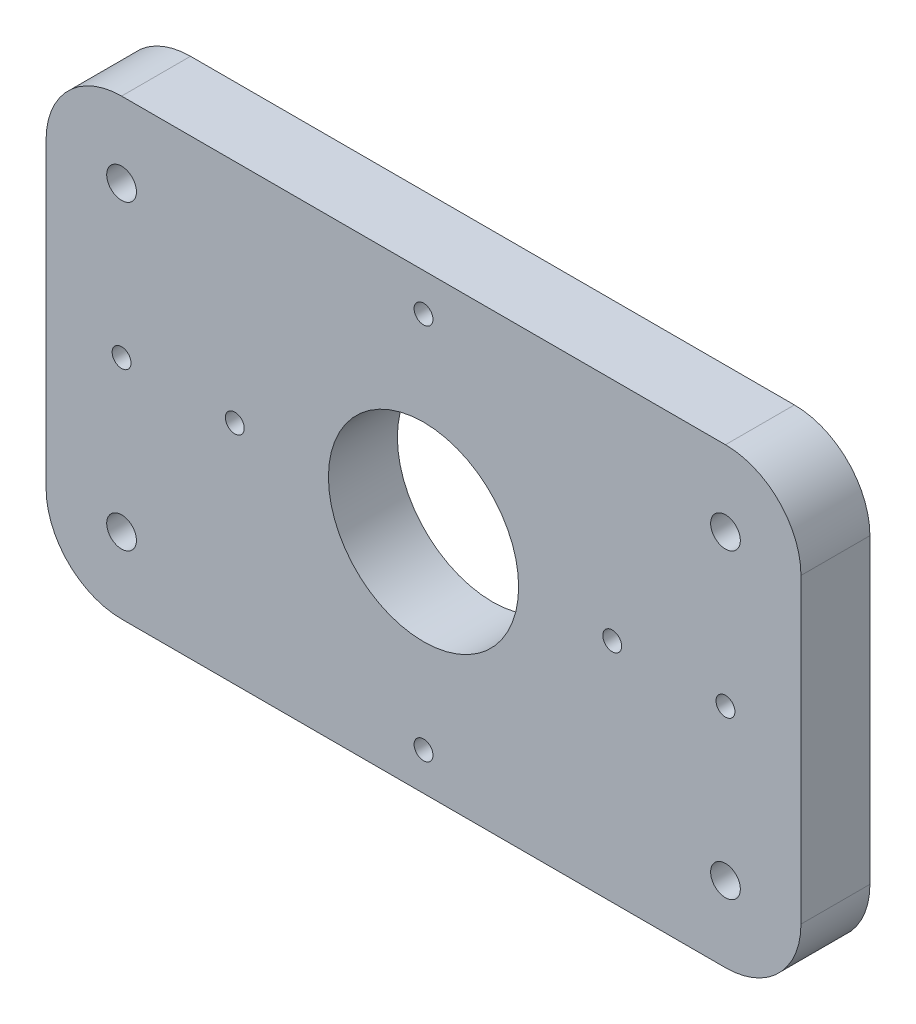
ISO-10303-21;
HEADER;
FILE_DESCRIPTION(('STEP AP214'),'2;1');
FILE_NAME('part.step','',(''),(''),'','','');
FILE_SCHEMA(('AUTOMOTIVE_DESIGN { 1 0 10303 214 1 1 1 1 }'));
ENDSEC;
DATA;
#1=APPLICATION_CONTEXT('core data for automotive mechanical design processes');
#2=APPLICATION_PROTOCOL_DEFINITION('international standard','automotive_design',2000,#1);
#3=PRODUCT_CONTEXT('',#1,'mechanical');
#4=PRODUCT('Part','Part','',(#3));
#5=PRODUCT_RELATED_PRODUCT_CATEGORY('part','',(#4));
#6=PRODUCT_DEFINITION_FORMATION('','',#4);
#7=PRODUCT_DEFINITION_CONTEXT('part definition',#1,'design');
#8=PRODUCT_DEFINITION('design','',#6,#7);
#9=PRODUCT_DEFINITION_SHAPE('','',#8);
#10=(LENGTH_UNIT() NAMED_UNIT(*) SI_UNIT(.MILLI.,.METRE.));
#11=(NAMED_UNIT(*) PLANE_ANGLE_UNIT() SI_UNIT($,.RADIAN.));
#12=(NAMED_UNIT(*) SI_UNIT($,.STERADIAN.) SOLID_ANGLE_UNIT());
#13=UNCERTAINTY_MEASURE_WITH_UNIT(LENGTH_MEASURE(1.E-05),#10,'distance_accuracy_value','');
#14=(GEOMETRIC_REPRESENTATION_CONTEXT(3) GLOBAL_UNCERTAINTY_ASSIGNED_CONTEXT((#13)) GLOBAL_UNIT_ASSIGNED_CONTEXT((#10,
#11,#12)) REPRESENTATION_CONTEXT('',''));
#15=CARTESIAN_POINT('',(0.,0.,0.));
#16=DIRECTION('',(0.,0.,1.));
#17=DIRECTION('',(1.,0.,0.));
#18=AXIS2_PLACEMENT_3D('',#15,#16,#17);
#19=CARTESIAN_POINT('',(0.,38.1,5.8));
#20=DIRECTION('',(0.,-1.,0.));
#21=DIRECTION('',(1.,0.,0.));
#22=AXIS2_PLACEMENT_3D('',#19,#20,#21);
#23=PLANE('',#22);
#24=DIRECTION('',(-1.,0.,0.));
#25=VECTOR('',#24,1.);
#26=CARTESIAN_POINT('',(0.,38.1,5.8));
#27=LINE('',#26,#25);
#28=CARTESIAN_POINT('',(6.35,38.1,5.8));
#29=VERTEX_POINT('',#28);
#30=CARTESIAN_POINT('',(-44.45,38.1,5.8));
#31=VERTEX_POINT('',#30);
#32=EDGE_CURVE('E115',#29,#31,#27,.T.);
#33=ORIENTED_EDGE('',*,*,#32,.F.);
#34=DIRECTION('',(0.,0.,1.));
#35=VECTOR('',#34,1.);
#36=CARTESIAN_POINT('',(6.35,38.1,0.));
#37=LINE('',#36,#35);
#38=CARTESIAN_POINT('',(6.35,38.1,0.));
#39=VERTEX_POINT('',#38);
#40=EDGE_CURVE('E132',#29,#39,#37,.F.);
#41=ORIENTED_EDGE('',*,*,#40,.T.);
#42=DIRECTION('',(-1.,0.,0.));
#43=VECTOR('',#42,1.);
#44=CARTESIAN_POINT('',(0.,38.1,0.));
#45=LINE('',#44,#43);
#46=CARTESIAN_POINT('',(-44.45,38.1,0.));
#47=VERTEX_POINT('',#46);
#48=EDGE_CURVE('E116',#39,#47,#45,.T.);
#49=ORIENTED_EDGE('',*,*,#48,.T.);
#50=DIRECTION('',(0.,0.,1.));
#51=VECTOR('',#50,1.);
#52=CARTESIAN_POINT('',(-44.45,38.1,5.8));
#53=LINE('',#52,#51);
#54=EDGE_CURVE('E129',#47,#31,#53,.T.);
#55=ORIENTED_EDGE('',*,*,#54,.T.);
#56=EDGE_LOOP('',(#33,#41,#49,#55));
#57=FACE_BOUND('',#56,.T.);
#58=ADVANCED_FACE('F34',(#57),#23,.F.);
#59=CARTESIAN_POINT('',(0.,0.,5.8));
#60=DIRECTION('',(0.,1.,0.));
#61=DIRECTION('',(-1.,0.,0.));
#62=AXIS2_PLACEMENT_3D('',#59,#60,#61);
#63=PLANE('',#62);
#64=DIRECTION('',(1.,0.,0.));
#65=VECTOR('',#64,1.);
#66=CARTESIAN_POINT('',(0.,0.,0.));
#67=LINE('',#66,#65);
#68=CARTESIAN_POINT('',(-44.45,0.,0.));
#69=VERTEX_POINT('',#68);
#70=CARTESIAN_POINT('',(6.35,0.,0.));
#71=VERTEX_POINT('',#70);
#72=EDGE_CURVE('E104',#69,#71,#67,.T.);
#73=ORIENTED_EDGE('',*,*,#72,.T.);
#74=DIRECTION('',(0.,0.,1.));
#75=VECTOR('',#74,1.);
#76=CARTESIAN_POINT('',(6.35,0.,5.8));
#77=LINE('',#76,#75);
#78=CARTESIAN_POINT('',(6.35,0.,5.8));
#79=VERTEX_POINT('',#78);
#80=EDGE_CURVE('E109',#71,#79,#77,.T.);
#81=ORIENTED_EDGE('',*,*,#80,.T.);
#82=DIRECTION('',(1.,0.,0.));
#83=VECTOR('',#82,1.);
#84=CARTESIAN_POINT('',(0.,0.,5.8));
#85=LINE('',#84,#83);
#86=CARTESIAN_POINT('',(-44.45,0.,5.8));
#87=VERTEX_POINT('',#86);
#88=EDGE_CURVE('E107',#87,#79,#85,.T.);
#89=ORIENTED_EDGE('',*,*,#88,.F.);
#90=DIRECTION('',(0.,0.,1.));
#91=VECTOR('',#90,1.);
#92=CARTESIAN_POINT('',(-44.45,0.,0.));
#93=LINE('',#92,#91);
#94=EDGE_CURVE('E101',#87,#69,#93,.F.);
#95=ORIENTED_EDGE('',*,*,#94,.T.);
#96=EDGE_LOOP('',(#73,#81,#89,#95));
#97=FACE_BOUND('',#96,.T.);
#98=ADVANCED_FACE('F102',(#97),#63,.F.);
#99=CARTESIAN_POINT('',(0.,38.1,5.8));
#100=DIRECTION('',(0.,0.,1.));
#101=DIRECTION('',(1.,0.,0.));
#102=AXIS2_PLACEMENT_3D('',#99,#100,#101);
#103=PLANE('',#102);
#104=CARTESIAN_POINT('',(6.35000000000002,19.05,5.8));
#105=DIRECTION('',(0.,0.,1.));
#106=DIRECTION('',(1.,0.,0.));
#107=AXIS2_PLACEMENT_3D('',#104,#105,#106);
#108=CIRCLE('',#107,0.79375);
#109=CARTESIAN_POINT('',(7.14375000000002,19.05,5.8));
#110=VERTEX_POINT('',#109);
#111=EDGE_CURVE('E235',#110,#110,#108,.T.);
#112=ORIENTED_EDGE('',*,*,#111,.F.);
#113=EDGE_LOOP('',(#112));
#114=FACE_BOUND('',#113,.T.);
#115=CARTESIAN_POINT('',(-44.45,19.05,5.8));
#116=DIRECTION('',(0.,0.,1.));
#117=DIRECTION('',(1.,0.,0.));
#118=AXIS2_PLACEMENT_3D('',#115,#116,#117);
#119=CIRCLE('',#118,0.793749999999999);
#120=CARTESIAN_POINT('',(-43.65625,19.05,5.8));
#121=VERTEX_POINT('',#120);
#122=EDGE_CURVE('E229',#121,#121,#119,.T.);
#123=ORIENTED_EDGE('',*,*,#122,.F.);
#124=EDGE_LOOP('',(#123));
#125=FACE_BOUND('',#124,.T.);
#126=CARTESIAN_POINT('',(-44.45,31.75,5.8));
#127=DIRECTION('',(0.,0.,1.));
#128=DIRECTION('',(1.,0.,0.));
#129=AXIS2_PLACEMENT_3D('',#126,#127,#128);
#130=CIRCLE('',#129,1.24999999999999);
#131=CARTESIAN_POINT('',(-43.2,31.75,5.8));
#132=VERTEX_POINT('',#131);
#133=EDGE_CURVE('E168',#132,#132,#130,.T.);
#134=ORIENTED_EDGE('',*,*,#133,.F.);
#135=EDGE_LOOP('',(#134));
#136=FACE_BOUND('',#135,.T.);
#137=CARTESIAN_POINT('',(6.35000000000002,31.75,5.8));
#138=DIRECTION('',(0.,0.,1.));
#139=DIRECTION('',(1.,0.,0.));
#140=AXIS2_PLACEMENT_3D('',#137,#138,#139);
#141=CIRCLE('',#140,1.24999999999999);
#142=CARTESIAN_POINT('',(7.6,31.75,5.8));
#143=VERTEX_POINT('',#142);
#144=EDGE_CURVE('E167',#143,#143,#141,.T.);
#145=ORIENTED_EDGE('',*,*,#144,.F.);
#146=EDGE_LOOP('',(#145));
#147=FACE_BOUND('',#146,.T.);
#148=CARTESIAN_POINT('',(6.35000000000002,6.35,5.8));
#149=DIRECTION('',(0.,0.,1.));
#150=DIRECTION('',(1.,0.,0.));
#151=AXIS2_PLACEMENT_3D('',#148,#149,#150);
#152=CIRCLE('',#151,1.24999999999999);
#153=CARTESIAN_POINT('',(7.6,6.35,5.8));
#154=VERTEX_POINT('',#153);
#155=EDGE_CURVE('E172',#154,#154,#152,.T.);
#156=ORIENTED_EDGE('',*,*,#155,.F.);
#157=EDGE_LOOP('',(#156));
#158=FACE_BOUND('',#157,.T.);
#159=CARTESIAN_POINT('',(-44.45,6.35000000000003,5.8));
#160=DIRECTION('',(0.,0.,1.));
#161=DIRECTION('',(1.,0.,0.));
#162=AXIS2_PLACEMENT_3D('',#159,#160,#161);
#163=CIRCLE('',#162,1.24999999999999);
#164=CARTESIAN_POINT('',(-43.2,6.35000000000003,5.8));
#165=VERTEX_POINT('',#164);
#166=EDGE_CURVE('E176',#165,#165,#163,.T.);
#167=ORIENTED_EDGE('',*,*,#166,.F.);
#168=EDGE_LOOP('',(#167));
#169=FACE_BOUND('',#168,.T.);
#170=CARTESIAN_POINT('',(-19.0500000000001,3.175,5.8));
#171=DIRECTION('',(0.,0.,1.));
#172=DIRECTION('',(1.,0.,0.));
#173=AXIS2_PLACEMENT_3D('',#170,#171,#172);
#174=CIRCLE('',#173,0.793749999999999);
#175=CARTESIAN_POINT('',(-18.2562500000001,3.175,5.8));
#176=VERTEX_POINT('',#175);
#177=EDGE_CURVE('E207',#176,#176,#174,.T.);
#178=ORIENTED_EDGE('',*,*,#177,.F.);
#179=EDGE_LOOP('',(#178));
#180=FACE_BOUND('',#179,.T.);
#181=CARTESIAN_POINT('',(-3.175,19.0499999999999,5.8));
#182=DIRECTION('',(0.,0.,1.));
#183=DIRECTION('',(1.,0.,0.));
#184=AXIS2_PLACEMENT_3D('',#181,#182,#183);
#185=CIRCLE('',#184,0.79375);
#186=CARTESIAN_POINT('',(-2.38125,19.0499999999999,5.8));
#187=VERTEX_POINT('',#186);
#188=EDGE_CURVE('E201',#187,#187,#185,.T.);
#189=ORIENTED_EDGE('',*,*,#188,.F.);
#190=EDGE_LOOP('',(#189));
#191=FACE_BOUND('',#190,.T.);
#192=CARTESIAN_POINT('',(-19.05,34.925,5.8));
#193=DIRECTION('',(0.,0.,1.));
#194=DIRECTION('',(1.,0.,0.));
#195=AXIS2_PLACEMENT_3D('',#192,#193,#194);
#196=CIRCLE('',#195,0.793749999999999);
#197=CARTESIAN_POINT('',(-18.25625,34.925,5.8));
#198=VERTEX_POINT('',#197);
#199=EDGE_CURVE('E195',#198,#198,#196,.T.);
#200=ORIENTED_EDGE('',*,*,#199,.F.);
#201=EDGE_LOOP('',(#200));
#202=FACE_BOUND('',#201,.T.);
#203=CARTESIAN_POINT('',(-34.925,19.05,5.8));
#204=DIRECTION('',(0.,0.,1.));
#205=DIRECTION('',(1.,0.,0.));
#206=AXIS2_PLACEMENT_3D('',#203,#204,#205);
#207=CIRCLE('',#206,0.793749999999999);
#208=CARTESIAN_POINT('',(-34.13125,19.05,5.8));
#209=VERTEX_POINT('',#208);
#210=EDGE_CURVE('E189',#209,#209,#207,.T.);
#211=ORIENTED_EDGE('',*,*,#210,.F.);
#212=EDGE_LOOP('',(#211));
#213=FACE_BOUND('',#212,.T.);
#214=CARTESIAN_POINT('',(-19.05,19.05,5.8));
#215=DIRECTION('',(0.,0.,1.));
#216=DIRECTION('',(1.,0.,0.));
#217=AXIS2_PLACEMENT_3D('',#214,#215,#216);
#218=CIRCLE('',#217,8.);
#219=CARTESIAN_POINT('',(-11.05,19.05,5.8));
#220=VERTEX_POINT('',#219);
#221=EDGE_CURVE('E182',#220,#220,#218,.T.);
#222=ORIENTED_EDGE('',*,*,#221,.F.);
#223=EDGE_LOOP('',(#222));
#224=FACE_BOUND('',#223,.T.);
#225=ORIENTED_EDGE('',*,*,#88,.T.);
#226=CARTESIAN_POINT('',(6.35,6.35,5.8));
#227=DIRECTION('',(0.,0.,1.));
#228=DIRECTION('',(1.,0.,0.));
#229=AXIS2_PLACEMENT_3D('',#226,#227,#228);
#230=CIRCLE('',#229,6.35);
#231=CARTESIAN_POINT('',(12.7,6.35,5.8));
#232=VERTEX_POINT('',#231);
#233=EDGE_CURVE('E154',#79,#232,#230,.T.);
#234=ORIENTED_EDGE('',*,*,#233,.T.);
#235=DIRECTION('',(0.,1.,0.));
#236=VECTOR('',#235,1.);
#237=CARTESIAN_POINT('',(12.7,0.,5.8));
#238=LINE('',#237,#236);
#239=CARTESIAN_POINT('',(12.7,31.75,5.8));
#240=VERTEX_POINT('',#239);
#241=EDGE_CURVE('E213',#232,#240,#238,.T.);
#242=ORIENTED_EDGE('',*,*,#241,.T.);
#243=CARTESIAN_POINT('',(6.35,31.75,5.8));
#244=DIRECTION('',(0.,0.,1.));
#245=DIRECTION('',(1.,0.,0.));
#246=AXIS2_PLACEMENT_3D('',#243,#244,#245);
#247=CIRCLE('',#246,6.35);
#248=EDGE_CURVE('E150',#240,#29,#247,.T.);
#249=ORIENTED_EDGE('',*,*,#248,.T.);
#250=ORIENTED_EDGE('',*,*,#32,.T.);
#251=CARTESIAN_POINT('',(-44.45,31.75,5.8));
#252=DIRECTION('',(0.,0.,1.));
#253=DIRECTION('',(1.,0.,0.));
#254=AXIS2_PLACEMENT_3D('',#251,#252,#253);
#255=CIRCLE('',#254,6.35);
#256=CARTESIAN_POINT('',(-50.8,31.75,5.8));
#257=VERTEX_POINT('',#256);
#258=EDGE_CURVE('E161',#31,#257,#255,.T.);
#259=ORIENTED_EDGE('',*,*,#258,.T.);
#260=DIRECTION('',(0.,-1.,0.));
#261=VECTOR('',#260,1.);
#262=CARTESIAN_POINT('',(-50.8,0.,5.8));
#263=LINE('',#262,#261);
#264=CARTESIAN_POINT('',(-50.8,6.34999999999999,5.8));
#265=VERTEX_POINT('',#264);
#266=EDGE_CURVE('E180',#257,#265,#263,.T.);
#267=ORIENTED_EDGE('',*,*,#266,.T.);
#268=CARTESIAN_POINT('',(-44.45,6.34999999999999,5.8));
#269=DIRECTION('',(0.,0.,1.));
#270=DIRECTION('',(1.,0.,0.));
#271=AXIS2_PLACEMENT_3D('',#268,#269,#270);
#272=CIRCLE('',#271,6.35);
#273=EDGE_CURVE('E159',#265,#87,#272,.T.);
#274=ORIENTED_EDGE('',*,*,#273,.T.);
#275=EDGE_LOOP('',(#225,#234,#242,#249,#250,#259,#267,#274));
#276=FACE_BOUND('',#275,.T.);
#277=ADVANCED_FACE('F251',(#114,#125,#136,#147,#158,#169,#180,#191,#202,#213,#224,#276),#103,.T.);
#278=CARTESIAN_POINT('',(0.,38.1,0.));
#279=DIRECTION('',(0.,0.,1.));
#280=DIRECTION('',(1.,0.,0.));
#281=AXIS2_PLACEMENT_3D('',#278,#279,#280);
#282=PLANE('',#281);
#283=CARTESIAN_POINT('',(6.35000000000002,19.05,0.));
#284=DIRECTION('',(0.,0.,1.));
#285=DIRECTION('',(1.,0.,0.));
#286=AXIS2_PLACEMENT_3D('',#283,#284,#285);
#287=CIRCLE('',#286,0.79375);
#288=CARTESIAN_POINT('',(7.14375000000002,19.05,0.));
#289=VERTEX_POINT('',#288);
#290=EDGE_CURVE('E232',#289,#289,#287,.T.);
#291=ORIENTED_EDGE('',*,*,#290,.T.);
#292=EDGE_LOOP('',(#291));
#293=FACE_BOUND('',#292,.T.);
#294=CARTESIAN_POINT('',(-44.45,19.05,0.));
#295=DIRECTION('',(0.,0.,1.));
#296=DIRECTION('',(1.,0.,0.));
#297=AXIS2_PLACEMENT_3D('',#294,#295,#296);
#298=CIRCLE('',#297,0.793749999999999);
#299=CARTESIAN_POINT('',(-43.65625,19.05,0.));
#300=VERTEX_POINT('',#299);
#301=EDGE_CURVE('E228',#300,#300,#298,.T.);
#302=ORIENTED_EDGE('',*,*,#301,.T.);
#303=EDGE_LOOP('',(#302));
#304=FACE_BOUND('',#303,.T.);
#305=CARTESIAN_POINT('',(-44.45,31.75,0.));
#306=DIRECTION('',(0.,0.,1.));
#307=DIRECTION('',(1.,0.,0.));
#308=AXIS2_PLACEMENT_3D('',#305,#306,#307);
#309=CIRCLE('',#308,1.24999999999999);
#310=CARTESIAN_POINT('',(-43.2,31.75,0.));
#311=VERTEX_POINT('',#310);
#312=EDGE_CURVE('E164',#311,#311,#309,.T.);
#313=ORIENTED_EDGE('',*,*,#312,.T.);
#314=EDGE_LOOP('',(#313));
#315=FACE_BOUND('',#314,.T.);
#316=CARTESIAN_POINT('',(6.35000000000002,31.75,0.));
#317=DIRECTION('',(0.,0.,1.));
#318=DIRECTION('',(1.,0.,0.));
#319=AXIS2_PLACEMENT_3D('',#316,#317,#318);
#320=CIRCLE('',#319,1.24999999999999);
#321=CARTESIAN_POINT('',(7.60000000000001,31.75,0.));
#322=VERTEX_POINT('',#321);
#323=EDGE_CURVE('E169',#322,#322,#320,.T.);
#324=ORIENTED_EDGE('',*,*,#323,.T.);
#325=EDGE_LOOP('',(#324));
#326=FACE_BOUND('',#325,.T.);
#327=CARTESIAN_POINT('',(6.35000000000002,6.35,0.));
#328=DIRECTION('',(0.,0.,1.));
#329=DIRECTION('',(1.,0.,0.));
#330=AXIS2_PLACEMENT_3D('',#327,#328,#329);
#331=CIRCLE('',#330,1.24999999999999);
#332=CARTESIAN_POINT('',(7.60000000000001,6.35,0.));
#333=VERTEX_POINT('',#332);
#334=EDGE_CURVE('E173',#333,#333,#331,.T.);
#335=ORIENTED_EDGE('',*,*,#334,.T.);
#336=EDGE_LOOP('',(#335));
#337=FACE_BOUND('',#336,.T.);
#338=CARTESIAN_POINT('',(-44.45,6.35000000000003,0.));
#339=DIRECTION('',(0.,0.,1.));
#340=DIRECTION('',(1.,0.,0.));
#341=AXIS2_PLACEMENT_3D('',#338,#339,#340);
#342=CIRCLE('',#341,1.24999999999999);
#343=CARTESIAN_POINT('',(-43.2,6.35000000000003,0.));
#344=VERTEX_POINT('',#343);
#345=EDGE_CURVE('E177',#344,#344,#342,.T.);
#346=ORIENTED_EDGE('',*,*,#345,.T.);
#347=EDGE_LOOP('',(#346));
#348=FACE_BOUND('',#347,.T.);
#349=CARTESIAN_POINT('',(-19.0500000000001,3.175,0.));
#350=DIRECTION('',(0.,0.,1.));
#351=DIRECTION('',(1.,0.,0.));
#352=AXIS2_PLACEMENT_3D('',#349,#350,#351);
#353=CIRCLE('',#352,0.793749999999999);
#354=CARTESIAN_POINT('',(-18.2562500000001,3.175,0.));
#355=VERTEX_POINT('',#354);
#356=EDGE_CURVE('E204',#355,#355,#353,.T.);
#357=ORIENTED_EDGE('',*,*,#356,.T.);
#358=EDGE_LOOP('',(#357));
#359=FACE_BOUND('',#358,.T.);
#360=CARTESIAN_POINT('',(-3.175,19.0499999999999,0.));
#361=DIRECTION('',(0.,0.,1.));
#362=DIRECTION('',(1.,0.,0.));
#363=AXIS2_PLACEMENT_3D('',#360,#361,#362);
#364=CIRCLE('',#363,0.79375);
#365=CARTESIAN_POINT('',(-2.38125,19.0499999999999,0.));
#366=VERTEX_POINT('',#365);
#367=EDGE_CURVE('E198',#366,#366,#364,.T.);
#368=ORIENTED_EDGE('',*,*,#367,.T.);
#369=EDGE_LOOP('',(#368));
#370=FACE_BOUND('',#369,.T.);
#371=CARTESIAN_POINT('',(-19.05,34.925,0.));
#372=DIRECTION('',(0.,0.,1.));
#373=DIRECTION('',(1.,0.,0.));
#374=AXIS2_PLACEMENT_3D('',#371,#372,#373);
#375=CIRCLE('',#374,0.793749999999999);
#376=CARTESIAN_POINT('',(-18.25625,34.925,0.));
#377=VERTEX_POINT('',#376);
#378=EDGE_CURVE('E192',#377,#377,#375,.T.);
#379=ORIENTED_EDGE('',*,*,#378,.T.);
#380=EDGE_LOOP('',(#379));
#381=FACE_BOUND('',#380,.T.);
#382=CARTESIAN_POINT('',(-34.925,19.05,0.));
#383=DIRECTION('',(0.,0.,1.));
#384=DIRECTION('',(1.,0.,0.));
#385=AXIS2_PLACEMENT_3D('',#382,#383,#384);
#386=CIRCLE('',#385,0.793749999999999);
#387=CARTESIAN_POINT('',(-34.13125,19.05,0.));
#388=VERTEX_POINT('',#387);
#389=EDGE_CURVE('E188',#388,#388,#386,.T.);
#390=ORIENTED_EDGE('',*,*,#389,.T.);
#391=EDGE_LOOP('',(#390));
#392=FACE_BOUND('',#391,.T.);
#393=CARTESIAN_POINT('',(-19.05,19.05,0.));
#394=DIRECTION('',(0.,0.,1.));
#395=DIRECTION('',(1.,0.,0.));
#396=AXIS2_PLACEMENT_3D('',#393,#394,#395);
#397=CIRCLE('',#396,8.);
#398=CARTESIAN_POINT('',(-11.05,19.05,0.));
#399=VERTEX_POINT('',#398);
#400=EDGE_CURVE('E144',#399,#399,#397,.T.);
#401=ORIENTED_EDGE('',*,*,#400,.T.);
#402=EDGE_LOOP('',(#401));
#403=FACE_BOUND('',#402,.T.);
#404=DIRECTION('',(0.,1.,0.));
#405=VECTOR('',#404,1.);
#406=CARTESIAN_POINT('',(12.7,0.,0.));
#407=LINE('',#406,#405);
#408=CARTESIAN_POINT('',(12.7,6.35,0.));
#409=VERTEX_POINT('',#408);
#410=CARTESIAN_POINT('',(12.7,31.75,0.));
#411=VERTEX_POINT('',#410);
#412=EDGE_CURVE('E210',#409,#411,#407,.T.);
#413=ORIENTED_EDGE('',*,*,#412,.F.);
#414=CARTESIAN_POINT('',(6.35,6.35,0.));
#415=DIRECTION('',(0.,0.,1.));
#416=DIRECTION('',(1.,0.,0.));
#417=AXIS2_PLACEMENT_3D('',#414,#415,#416);
#418=CIRCLE('',#417,6.35);
#419=EDGE_CURVE('E114',#409,#71,#418,.F.);
#420=ORIENTED_EDGE('',*,*,#419,.T.);
#421=ORIENTED_EDGE('',*,*,#72,.F.);
#422=CARTESIAN_POINT('',(-44.45,6.34999999999999,0.));
#423=DIRECTION('',(0.,0.,1.));
#424=DIRECTION('',(1.,0.,0.));
#425=AXIS2_PLACEMENT_3D('',#422,#423,#424);
#426=CIRCLE('',#425,6.35);
#427=CARTESIAN_POINT('',(-50.8,6.34999999999999,0.));
#428=VERTEX_POINT('',#427);
#429=EDGE_CURVE('E49',#69,#428,#426,.F.);
#430=ORIENTED_EDGE('',*,*,#429,.T.);
#431=DIRECTION('',(0.,-1.,0.));
#432=VECTOR('',#431,1.);
#433=CARTESIAN_POINT('',(-50.8,0.,0.));
#434=LINE('',#433,#432);
#435=CARTESIAN_POINT('',(-50.8,31.75,0.));
#436=VERTEX_POINT('',#435);
#437=EDGE_CURVE('E215',#436,#428,#434,.T.);
#438=ORIENTED_EDGE('',*,*,#437,.F.);
#439=CARTESIAN_POINT('',(-44.45,31.75,0.));
#440=DIRECTION('',(0.,0.,1.));
#441=DIRECTION('',(1.,0.,0.));
#442=AXIS2_PLACEMENT_3D('',#439,#440,#441);
#443=CIRCLE('',#442,6.35);
#444=EDGE_CURVE('E121',#436,#47,#443,.F.);
#445=ORIENTED_EDGE('',*,*,#444,.T.);
#446=ORIENTED_EDGE('',*,*,#48,.F.);
#447=CARTESIAN_POINT('',(6.35,31.75,0.));
#448=DIRECTION('',(0.,0.,1.));
#449=DIRECTION('',(1.,0.,0.));
#450=AXIS2_PLACEMENT_3D('',#447,#448,#449);
#451=CIRCLE('',#450,6.35);
#452=EDGE_CURVE('E120',#39,#411,#451,.F.);
#453=ORIENTED_EDGE('',*,*,#452,.T.);
#454=EDGE_LOOP('',(#413,#420,#421,#430,#438,#445,#446,#453));
#455=FACE_BOUND('',#454,.T.);
#456=ADVANCED_FACE('F112',(#293,#304,#315,#326,#337,#348,#359,#370,#381,#392,#403,#455),#282,.F.);
#457=CARTESIAN_POINT('',(-19.05,19.05,-6.9));
#458=DIRECTION('',(0.,0.,1.));
#459=DIRECTION('',(1.,0.,0.));
#460=AXIS2_PLACEMENT_3D('',#457,#458,#459);
#461=CYLINDRICAL_SURFACE('',#460,8.);
#462=ORIENTED_EDGE('',*,*,#221,.T.);
#463=EDGE_LOOP('',(#462));
#464=FACE_BOUND('',#463,.T.);
#465=ORIENTED_EDGE('',*,*,#400,.F.);
#466=EDGE_LOOP('',(#465));
#467=FACE_BOUND('',#466,.T.);
#468=ADVANCED_FACE('F294',(#464,#467),#461,.F.);
#469=CARTESIAN_POINT('',(-34.925,19.05,0.));
#470=DIRECTION('',(0.,0.,1.));
#471=DIRECTION('',(1.,0.,0.));
#472=AXIS2_PLACEMENT_3D('',#469,#470,#471);
#473=CYLINDRICAL_SURFACE('',#472,0.793749999999999);
#474=ORIENTED_EDGE('',*,*,#389,.F.);
#475=EDGE_LOOP('',(#474));
#476=FACE_BOUND('',#475,.T.);
#477=ORIENTED_EDGE('',*,*,#210,.T.);
#478=EDGE_LOOP('',(#477));
#479=FACE_BOUND('',#478,.T.);
#480=ADVANCED_FACE('F298',(#476,#479),#473,.F.);
#481=CARTESIAN_POINT('',(-19.05,34.925,0.));
#482=DIRECTION('',(0.,0.,1.));
#483=DIRECTION('',(1.,0.,0.));
#484=AXIS2_PLACEMENT_3D('',#481,#482,#483);
#485=CYLINDRICAL_SURFACE('',#484,0.793749999999999);
#486=ORIENTED_EDGE('',*,*,#378,.F.);
#487=EDGE_LOOP('',(#486));
#488=FACE_BOUND('',#487,.T.);
#489=ORIENTED_EDGE('',*,*,#199,.T.);
#490=EDGE_LOOP('',(#489));
#491=FACE_BOUND('',#490,.T.);
#492=ADVANCED_FACE('F302',(#488,#491),#485,.F.);
#493=CARTESIAN_POINT('',(-3.175,19.0499999999999,0.));
#494=DIRECTION('',(0.,0.,1.));
#495=DIRECTION('',(1.,0.,0.));
#496=AXIS2_PLACEMENT_3D('',#493,#494,#495);
#497=CYLINDRICAL_SURFACE('',#496,0.79375);
#498=ORIENTED_EDGE('',*,*,#367,.F.);
#499=EDGE_LOOP('',(#498));
#500=FACE_BOUND('',#499,.T.);
#501=ORIENTED_EDGE('',*,*,#188,.T.);
#502=EDGE_LOOP('',(#501));
#503=FACE_BOUND('',#502,.T.);
#504=ADVANCED_FACE('F306',(#500,#503),#497,.F.);
#505=CARTESIAN_POINT('',(-19.0500000000001,3.175,0.));
#506=DIRECTION('',(0.,0.,1.));
#507=DIRECTION('',(1.,0.,0.));
#508=AXIS2_PLACEMENT_3D('',#505,#506,#507);
#509=CYLINDRICAL_SURFACE('',#508,0.793749999999999);
#510=ORIENTED_EDGE('',*,*,#356,.F.);
#511=EDGE_LOOP('',(#510));
#512=FACE_BOUND('',#511,.T.);
#513=ORIENTED_EDGE('',*,*,#177,.T.);
#514=EDGE_LOOP('',(#513));
#515=FACE_BOUND('',#514,.T.);
#516=ADVANCED_FACE('F310',(#512,#515),#509,.F.);
#517=CARTESIAN_POINT('',(12.7,0.,0.));
#518=DIRECTION('',(1.,0.,0.));
#519=DIRECTION('',(0.,0.,-1.));
#520=AXIS2_PLACEMENT_3D('',#517,#518,#519);
#521=PLANE('',#520);
#522=ORIENTED_EDGE('',*,*,#241,.F.);
#523=DIRECTION('',(0.,0.,1.));
#524=VECTOR('',#523,1.);
#525=CARTESIAN_POINT('',(12.7,6.35,0.));
#526=LINE('',#525,#524);
#527=EDGE_CURVE('E124',#232,#409,#526,.F.);
#528=ORIENTED_EDGE('',*,*,#527,.T.);
#529=ORIENTED_EDGE('',*,*,#412,.T.);
#530=DIRECTION('',(0.,0.,1.));
#531=VECTOR('',#530,1.);
#532=CARTESIAN_POINT('',(12.7,31.75,5.8));
#533=LINE('',#532,#531);
#534=EDGE_CURVE('E149',#411,#240,#533,.T.);
#535=ORIENTED_EDGE('',*,*,#534,.T.);
#536=EDGE_LOOP('',(#522,#528,#529,#535));
#537=FACE_BOUND('',#536,.T.);
#538=ADVANCED_FACE('F278',(#537),#521,.T.);
#539=CARTESIAN_POINT('',(-50.8,0.,0.));
#540=DIRECTION('',(-1.,0.,0.));
#541=DIRECTION('',(0.,0.,1.));
#542=AXIS2_PLACEMENT_3D('',#539,#540,#541);
#543=PLANE('',#542);
#544=ORIENTED_EDGE('',*,*,#437,.T.);
#545=DIRECTION('',(0.,0.,1.));
#546=VECTOR('',#545,1.);
#547=CARTESIAN_POINT('',(-50.8,6.34999999999999,5.8));
#548=LINE('',#547,#546);
#549=EDGE_CURVE('E11',#428,#265,#548,.T.);
#550=ORIENTED_EDGE('',*,*,#549,.T.);
#551=ORIENTED_EDGE('',*,*,#266,.F.);
#552=DIRECTION('',(0.,0.,1.));
#553=VECTOR('',#552,1.);
#554=CARTESIAN_POINT('',(-50.8,31.75,0.));
#555=LINE('',#554,#553);
#556=EDGE_CURVE('E42',#257,#436,#555,.F.);
#557=ORIENTED_EDGE('',*,*,#556,.T.);
#558=EDGE_LOOP('',(#544,#550,#551,#557));
#559=FACE_BOUND('',#558,.T.);
#560=ADVANCED_FACE('F275',(#559),#543,.T.);
#561=CARTESIAN_POINT('',(-44.45,6.35000000000003,5.8));
#562=DIRECTION('',(0.,0.,1.));
#563=DIRECTION('',(1.,0.,0.));
#564=AXIS2_PLACEMENT_3D('',#561,#562,#563);
#565=CYLINDRICAL_SURFACE('',#564,1.24999999999999);
#566=ORIENTED_EDGE('',*,*,#166,.T.);
#567=EDGE_LOOP('',(#566));
#568=FACE_BOUND('',#567,.T.);
#569=ORIENTED_EDGE('',*,*,#345,.F.);
#570=EDGE_LOOP('',(#569));
#571=FACE_BOUND('',#570,.T.);
#572=ADVANCED_FACE('F319',(#568,#571),#565,.F.);
#573=CARTESIAN_POINT('',(6.35000000000002,6.35,5.8));
#574=DIRECTION('',(0.,0.,1.));
#575=DIRECTION('',(1.,0.,0.));
#576=AXIS2_PLACEMENT_3D('',#573,#574,#575);
#577=CYLINDRICAL_SURFACE('',#576,1.24999999999999);
#578=ORIENTED_EDGE('',*,*,#155,.T.);
#579=EDGE_LOOP('',(#578));
#580=FACE_BOUND('',#579,.T.);
#581=ORIENTED_EDGE('',*,*,#334,.F.);
#582=EDGE_LOOP('',(#581));
#583=FACE_BOUND('',#582,.T.);
#584=ADVANCED_FACE('F322',(#580,#583),#577,.F.);
#585=CARTESIAN_POINT('',(6.35000000000002,31.75,5.8));
#586=DIRECTION('',(0.,0.,1.));
#587=DIRECTION('',(1.,0.,0.));
#588=AXIS2_PLACEMENT_3D('',#585,#586,#587);
#589=CYLINDRICAL_SURFACE('',#588,1.24999999999999);
#590=ORIENTED_EDGE('',*,*,#144,.T.);
#591=EDGE_LOOP('',(#590));
#592=FACE_BOUND('',#591,.T.);
#593=ORIENTED_EDGE('',*,*,#323,.F.);
#594=EDGE_LOOP('',(#593));
#595=FACE_BOUND('',#594,.T.);
#596=ADVANCED_FACE('F326',(#592,#595),#589,.F.);
#597=CARTESIAN_POINT('',(-44.45,31.75,5.8));
#598=DIRECTION('',(0.,0.,1.));
#599=DIRECTION('',(1.,0.,0.));
#600=AXIS2_PLACEMENT_3D('',#597,#598,#599);
#601=CYLINDRICAL_SURFACE('',#600,1.24999999999999);
#602=ORIENTED_EDGE('',*,*,#133,.T.);
#603=EDGE_LOOP('',(#602));
#604=FACE_BOUND('',#603,.T.);
#605=ORIENTED_EDGE('',*,*,#312,.F.);
#606=EDGE_LOOP('',(#605));
#607=FACE_BOUND('',#606,.T.);
#608=ADVANCED_FACE('F330',(#604,#607),#601,.F.);
#609=CARTESIAN_POINT('',(-44.45,19.05,0.));
#610=DIRECTION('',(0.,0.,1.));
#611=DIRECTION('',(1.,0.,0.));
#612=AXIS2_PLACEMENT_3D('',#609,#610,#611);
#613=CYLINDRICAL_SURFACE('',#612,0.793749999999999);
#614=ORIENTED_EDGE('',*,*,#301,.F.);
#615=EDGE_LOOP('',(#614));
#616=FACE_BOUND('',#615,.T.);
#617=ORIENTED_EDGE('',*,*,#122,.T.);
#618=EDGE_LOOP('',(#617));
#619=FACE_BOUND('',#618,.T.);
#620=ADVANCED_FACE('F247',(#616,#619),#613,.F.);
#621=CARTESIAN_POINT('',(6.35000000000002,19.05,0.));
#622=DIRECTION('',(0.,0.,1.));
#623=DIRECTION('',(1.,0.,0.));
#624=AXIS2_PLACEMENT_3D('',#621,#622,#623);
#625=CYLINDRICAL_SURFACE('',#624,0.79375);
#626=ORIENTED_EDGE('',*,*,#290,.F.);
#627=EDGE_LOOP('',(#626));
#628=FACE_BOUND('',#627,.T.);
#629=ORIENTED_EDGE('',*,*,#111,.T.);
#630=EDGE_LOOP('',(#629));
#631=FACE_BOUND('',#630,.T.);
#632=ADVANCED_FACE('F243',(#628,#631),#625,.F.);
#633=CARTESIAN_POINT('',(6.35,6.35,5.8));
#634=DIRECTION('',(0.,0.,-1.));
#635=DIRECTION('',(-1.,0.,0.));
#636=AXIS2_PLACEMENT_3D('',#633,#634,#635);
#637=CYLINDRICAL_SURFACE('',#636,6.35);
#638=ORIENTED_EDGE('',*,*,#419,.F.);
#639=ORIENTED_EDGE('',*,*,#527,.F.);
#640=ORIENTED_EDGE('',*,*,#233,.F.);
#641=ORIENTED_EDGE('',*,*,#80,.F.);
#642=EDGE_LOOP('',(#638,#639,#640,#641));
#643=FACE_BOUND('',#642,.T.);
#644=ADVANCED_FACE('F246',(#643),#637,.T.);
#645=CARTESIAN_POINT('',(6.35,31.75,0.));
#646=DIRECTION('',(0.,0.,-1.));
#647=DIRECTION('',(-1.,0.,0.));
#648=AXIS2_PLACEMENT_3D('',#645,#646,#647);
#649=CYLINDRICAL_SURFACE('',#648,6.35);
#650=ORIENTED_EDGE('',*,*,#452,.F.);
#651=ORIENTED_EDGE('',*,*,#40,.F.);
#652=ORIENTED_EDGE('',*,*,#248,.F.);
#653=ORIENTED_EDGE('',*,*,#534,.F.);
#654=EDGE_LOOP('',(#650,#651,#652,#653));
#655=FACE_BOUND('',#654,.T.);
#656=ADVANCED_FACE('F147',(#655),#649,.T.);
#657=CARTESIAN_POINT('',(-44.45,6.34999999999999,0.));
#658=DIRECTION('',(0.,0.,-1.));
#659=DIRECTION('',(-1.,0.,0.));
#660=AXIS2_PLACEMENT_3D('',#657,#658,#659);
#661=CYLINDRICAL_SURFACE('',#660,6.35);
#662=ORIENTED_EDGE('',*,*,#429,.F.);
#663=ORIENTED_EDGE('',*,*,#94,.F.);
#664=ORIENTED_EDGE('',*,*,#273,.F.);
#665=ORIENTED_EDGE('',*,*,#549,.F.);
#666=EDGE_LOOP('',(#662,#663,#664,#665));
#667=FACE_BOUND('',#666,.T.);
#668=ADVANCED_FACE('F119',(#667),#661,.T.);
#669=CARTESIAN_POINT('',(-44.45,31.75,5.8));
#670=DIRECTION('',(0.,0.,-1.));
#671=DIRECTION('',(-1.,0.,0.));
#672=AXIS2_PLACEMENT_3D('',#669,#670,#671);
#673=CYLINDRICAL_SURFACE('',#672,6.35);
#674=ORIENTED_EDGE('',*,*,#444,.F.);
#675=ORIENTED_EDGE('',*,*,#556,.F.);
#676=ORIENTED_EDGE('',*,*,#258,.F.);
#677=ORIENTED_EDGE('',*,*,#54,.F.);
#678=EDGE_LOOP('',(#674,#675,#676,#677));
#679=FACE_BOUND('',#678,.T.);
#680=ADVANCED_FACE('F36',(#679),#673,.T.);
#681=CLOSED_SHELL('',(#58,#98,#277,#456,#468,#480,#492,#504,#516,#538,#560,#572,#584,#596,#608,
#620,#632,#644,#656,#668,#680));
#682=MANIFOLD_SOLID_BREP('B2',#681);
#683=ADVANCED_BREP_SHAPE_REPRESENTATION('',(#18,#682),#14);
#684=SHAPE_DEFINITION_REPRESENTATION(#9,#683);
ENDSEC;
END-ISO-10303-21;
